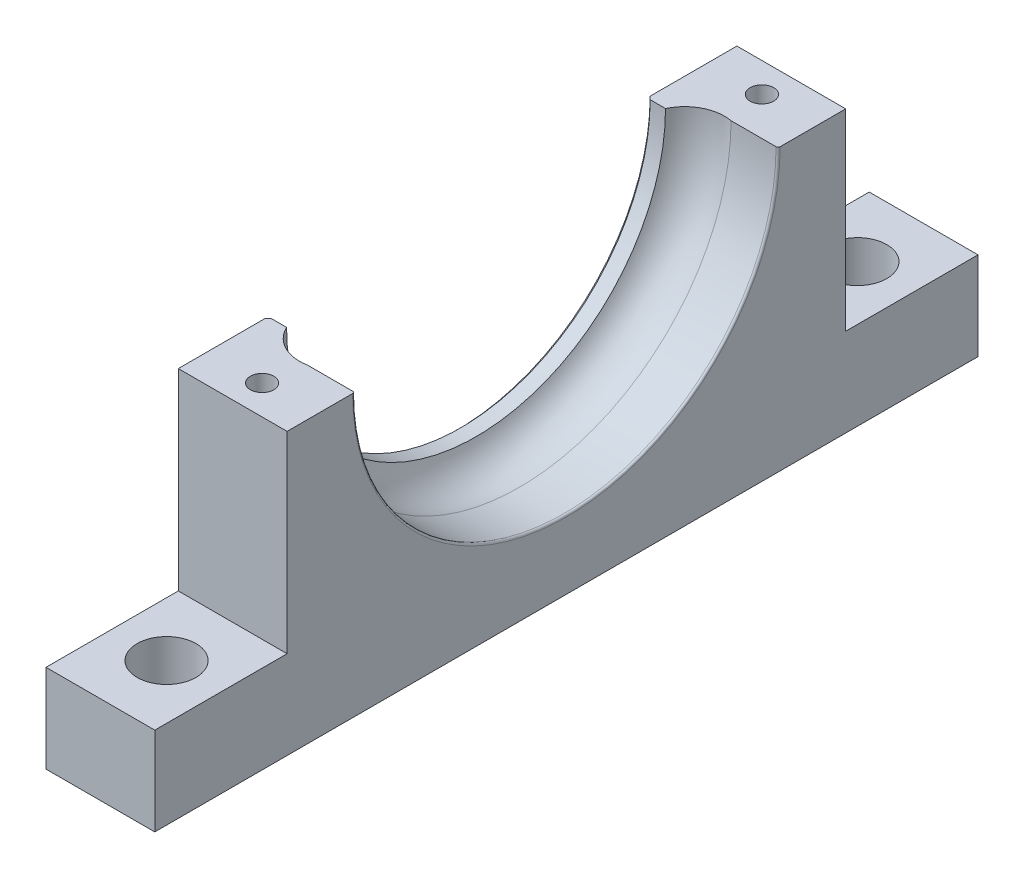
ISO-10303-21;
HEADER;
FILE_DESCRIPTION(('STEP AP214'),'2;1');
FILE_NAME('part.step','',(''),(''),'','','');
FILE_SCHEMA(('AUTOMOTIVE_DESIGN { 1 0 10303 214 1 1 1 1 }'));
ENDSEC;
DATA;
#1=APPLICATION_CONTEXT('core data for automotive mechanical design processes');
#2=APPLICATION_PROTOCOL_DEFINITION('international standard','automotive_design',2000,#1);
#3=PRODUCT_CONTEXT('',#1,'mechanical');
#4=PRODUCT('Part','Part','',(#3));
#5=PRODUCT_RELATED_PRODUCT_CATEGORY('part','',(#4));
#6=PRODUCT_DEFINITION_FORMATION('','',#4);
#7=PRODUCT_DEFINITION_CONTEXT('part definition',#1,'design');
#8=PRODUCT_DEFINITION('design','',#6,#7);
#9=PRODUCT_DEFINITION_SHAPE('','',#8);
#10=(LENGTH_UNIT() NAMED_UNIT(*) SI_UNIT(.MILLI.,.METRE.));
#11=(NAMED_UNIT(*) PLANE_ANGLE_UNIT() SI_UNIT($,.RADIAN.));
#12=(NAMED_UNIT(*) SI_UNIT($,.STERADIAN.) SOLID_ANGLE_UNIT());
#13=UNCERTAINTY_MEASURE_WITH_UNIT(LENGTH_MEASURE(1.E-05),#10,'distance_accuracy_value','');
#14=(GEOMETRIC_REPRESENTATION_CONTEXT(3) GLOBAL_UNCERTAINTY_ASSIGNED_CONTEXT((#13)) GLOBAL_UNIT_ASSIGNED_CONTEXT((#10,
#11,#12)) REPRESENTATION_CONTEXT('',''));
#15=CARTESIAN_POINT('',(0.,0.,0.));
#16=DIRECTION('',(0.,0.,1.));
#17=DIRECTION('',(1.,0.,0.));
#18=AXIS2_PLACEMENT_3D('',#15,#16,#17);
#19=CARTESIAN_POINT('',(-0.159790862732746,0.,95.0000002366093));
#20=DIRECTION('',(0.,-1.,0.));
#21=DIRECTION('',(0.,0.,-1.));
#22=AXIS2_PLACEMENT_3D('',#19,#20,#21);
#23=PLANE('',#22);
#24=DIRECTION('',(0.,0.,1.));
#25=VECTOR('',#24,1.);
#26=CARTESIAN_POINT('',(0.,0.,0.));
#27=LINE('',#26,#25);
#28=CARTESIAN_POINT('',(0.,0.,65.5));
#29=VERTEX_POINT('',#28);
#30=CARTESIAN_POINT('',(0.,0.,95.0000002366093));
#31=VERTEX_POINT('',#30);
#32=EDGE_CURVE('E256',#29,#31,#27,.T.);
#33=ORIENTED_EDGE('',*,*,#32,.T.);
#34=DIRECTION('',(1.,0.,0.));
#35=VECTOR('',#34,1.);
#36=CARTESIAN_POINT('',(37.,0.,95.0000002366093));
#37=LINE('',#36,#35);
#38=CARTESIAN_POINT('',(37.,0.,95.0000002366093));
#39=VERTEX_POINT('',#38);
#40=EDGE_CURVE('E51',#31,#39,#37,.T.);
#41=ORIENTED_EDGE('',*,*,#40,.T.);
#42=DIRECTION('',(0.,0.,-1.));
#43=VECTOR('',#42,1.);
#44=CARTESIAN_POINT('',(36.9999999999182,0.,0.));
#45=LINE('',#44,#43);
#46=CARTESIAN_POINT('',(36.9999999999182,0.,72.7099857785109));
#47=VERTEX_POINT('',#46);
#48=EDGE_CURVE('E66',#39,#47,#45,.T.);
#49=ORIENTED_EDGE('',*,*,#48,.T.);
#50=CARTESIAN_POINT('',(36.2999999999917,0.,72.7100000000707));
#51=DIRECTION('',(0.,-1.,0.));
#52=DIRECTION('',(0.,0.,-1.));
#53=AXIS2_PLACEMENT_3D('',#50,#51,#52);
#54=CIRCLE('',#53,0.700000000070949);
#55=CARTESIAN_POINT('',(36.2999999999917,0.,72.0099999999997));
#56=VERTEX_POINT('',#55);
#57=EDGE_CURVE('E240',#47,#56,#54,.F.);
#58=ORIENTED_EDGE('',*,*,#57,.T.);
#59=DIRECTION('',(1.,0.,0.));
#60=VECTOR('',#59,1.);
#61=CARTESIAN_POINT('',(-0.00128809151422752,0.,72.0099999999997));
#62=LINE('',#61,#60);
#63=CARTESIAN_POINT('',(21.002086329446,0.,72.0099999999998));
#64=VERTEX_POINT('',#63);
#65=EDGE_CURVE('E241',#56,#64,#62,.F.);
#66=ORIENTED_EDGE('',*,*,#65,.T.);
#67=CARTESIAN_POINT('',(18.4999999999997,0.,58.75));
#68=DIRECTION('',(0.,-1.,0.));
#69=DIRECTION('',(0.,0.,-1.));
#70=AXIS2_PLACEMENT_3D('',#67,#68,#69);
#71=CIRCLE('',#70,13.4939999999998);
#72=CARTESIAN_POINT('',(6.26897240621208,0.,64.45));
#73=VERTEX_POINT('',#72);
#74=EDGE_CURVE('E245',#64,#73,#71,.T.);
#75=ORIENTED_EDGE('',*,*,#74,.T.);
#76=DIRECTION('',(1.,0.,0.));
#77=VECTOR('',#76,1.);
#78=CARTESIAN_POINT('',(-0.00128809151422752,0.,64.45));
#79=LINE('',#78,#77);
#80=CARTESIAN_POINT('',(1.05,0.,64.45));
#81=VERTEX_POINT('',#80);
#82=EDGE_CURVE('E249',#73,#81,#79,.F.);
#83=ORIENTED_EDGE('',*,*,#82,.T.);
#84=DIRECTION('',(-0.707106781186544,0.,0.707106781186551));
#85=VECTOR('',#84,1.);
#86=CARTESIAN_POINT('',(65.4999999999994,0.,0.));
#87=LINE('',#86,#85);
#88=EDGE_CURVE('E46',#81,#29,#87,.T.);
#89=ORIENTED_EDGE('',*,*,#88,.T.);
#90=EDGE_LOOP('',(#33,#41,#49,#58,#66,#75,#83,#89));
#91=FACE_BOUND('',#90,.T.);
#92=CARTESIAN_POINT('',(18.5,0.,85.0000002366094));
#93=DIRECTION('',(0.,-1.,0.));
#94=DIRECTION('',(0.,0.,-1.));
#95=AXIS2_PLACEMENT_3D('',#92,#93,#94);
#96=CIRCLE('',#95,4.);
#97=CARTESIAN_POINT('',(18.5,0.,81.0000002366094));
#98=VERTEX_POINT('',#97);
#99=EDGE_CURVE('E11',#98,#98,#96,.T.);
#100=ORIENTED_EDGE('',*,*,#99,.T.);
#101=EDGE_LOOP('',(#100));
#102=FACE_BOUND('',#101,.T.);
#103=ADVANCED_FACE('F43',(#91,#102),#23,.F.);
#104=CARTESIAN_POINT('',(0.,0.,-95.0000002366093));
#105=VERTEX_POINT('',#104);
#106=CARTESIAN_POINT('',(0.,0.,-65.5));
#107=VERTEX_POINT('',#106);
#108=EDGE_CURVE('E231',#105,#107,#27,.T.);
#109=ORIENTED_EDGE('',*,*,#108,.T.);
#110=DIRECTION('',(0.707106781186544,0.,0.707106781186551));
#111=VECTOR('',#110,1.);
#112=CARTESIAN_POINT('',(65.4999999999994,0.,0.));
#113=LINE('',#112,#111);
#114=CARTESIAN_POINT('',(1.05,0.,-64.45));
#115=VERTEX_POINT('',#114);
#116=EDGE_CURVE('E253',#107,#115,#113,.T.);
#117=ORIENTED_EDGE('',*,*,#116,.T.);
#118=DIRECTION('',(1.,0.,0.));
#119=VECTOR('',#118,1.);
#120=CARTESIAN_POINT('',(-0.00128809151422752,0.,-64.45));
#121=LINE('',#120,#119);
#122=CARTESIAN_POINT('',(6.26897240621208,0.,-64.45));
#123=VERTEX_POINT('',#122);
#124=EDGE_CURVE('E250',#115,#123,#121,.T.);
#125=ORIENTED_EDGE('',*,*,#124,.T.);
#126=CARTESIAN_POINT('',(18.4999999999997,0.,-58.75));
#127=DIRECTION('',(0.,-1.,0.));
#128=DIRECTION('',(0.,0.,-1.));
#129=AXIS2_PLACEMENT_3D('',#126,#127,#128);
#130=CIRCLE('',#129,13.4939999999998);
#131=CARTESIAN_POINT('',(21.002086329446,0.,-72.0099999999998));
#132=VERTEX_POINT('',#131);
#133=EDGE_CURVE('E246',#123,#132,#130,.T.);
#134=ORIENTED_EDGE('',*,*,#133,.T.);
#135=DIRECTION('',(1.,0.,0.));
#136=VECTOR('',#135,1.);
#137=CARTESIAN_POINT('',(-0.00128809151422752,0.,-72.0099999999997));
#138=LINE('',#137,#136);
#139=CARTESIAN_POINT('',(36.2999999999917,0.,-72.0099999999997));
#140=VERTEX_POINT('',#139);
#141=EDGE_CURVE('E242',#132,#140,#138,.T.);
#142=ORIENTED_EDGE('',*,*,#141,.T.);
#143=CARTESIAN_POINT('',(36.2999999999917,0.,-72.7100000000707));
#144=DIRECTION('',(0.,-1.,0.));
#145=DIRECTION('',(0.,0.,-1.));
#146=AXIS2_PLACEMENT_3D('',#143,#144,#145);
#147=CIRCLE('',#146,0.700000000070949);
#148=CARTESIAN_POINT('',(36.9999999999182,0.,-72.7099857785109));
#149=VERTEX_POINT('',#148);
#150=EDGE_CURVE('E237',#140,#149,#147,.F.);
#151=ORIENTED_EDGE('',*,*,#150,.T.);
#152=CARTESIAN_POINT('',(37.,0.,-95.0000002366093));
#153=VERTEX_POINT('',#152);
#154=EDGE_CURVE('E233',#149,#153,#45,.T.);
#155=ORIENTED_EDGE('',*,*,#154,.T.);
#156=DIRECTION('',(1.,0.,0.));
#157=VECTOR('',#156,1.);
#158=CARTESIAN_POINT('',(37.,0.,-95.0000002366093));
#159=LINE('',#158,#157);
#160=EDGE_CURVE('E163',#105,#153,#159,.T.);
#161=ORIENTED_EDGE('',*,*,#160,.F.);
#162=EDGE_LOOP('',(#109,#117,#125,#134,#142,#151,#155,#161));
#163=FACE_BOUND('',#162,.T.);
#164=CARTESIAN_POINT('',(18.5,0.,-85.0000002366094));
#165=DIRECTION('',(0.,-1.,0.));
#166=DIRECTION('',(0.,0.,-1.));
#167=AXIS2_PLACEMENT_3D('',#164,#165,#166);
#168=CIRCLE('',#167,4.);
#169=CARTESIAN_POINT('',(18.5,0.,-89.0000002366094));
#170=VERTEX_POINT('',#169);
#171=EDGE_CURVE('E228',#170,#170,#168,.F.);
#172=ORIENTED_EDGE('',*,*,#171,.F.);
#173=EDGE_LOOP('',(#172));
#174=FACE_BOUND('',#173,.T.);
#175=ADVANCED_FACE('F323',(#163,#174),#23,.F.);
#176=CARTESIAN_POINT('',(18.5,-55.4999999999999,-85.0000002366095));
#177=DIRECTION('',(0.,1.,0.));
#178=DIRECTION('',(0.,0.,1.));
#179=AXIS2_PLACEMENT_3D('',#176,#177,#178);
#180=PLANE('',#179);
#181=CARTESIAN_POINT('',(18.5,-55.4999999999999,-85.0000002366095));
#182=DIRECTION('',(0.,1.,0.));
#183=DIRECTION('',(0.,0.,1.));
#184=AXIS2_PLACEMENT_3D('',#181,#182,#183);
#185=CIRCLE('',#184,4.);
#186=CARTESIAN_POINT('',(18.5,-55.4999999999999,-81.0000002366094));
#187=VERTEX_POINT('',#186);
#188=EDGE_CURVE('E187',#187,#187,#185,.T.);
#189=ORIENTED_EDGE('',*,*,#188,.T.);
#190=EDGE_LOOP('',(#189));
#191=FACE_BOUND('',#190,.T.);
#192=ADVANCED_FACE('F327',(#191),#180,.T.);
#193=CARTESIAN_POINT('',(18.5,-55.4999999999999,-85.0000002366095));
#194=DIRECTION('',(0.,1.,0.));
#195=DIRECTION('',(0.,0.,1.));
#196=AXIS2_PLACEMENT_3D('',#193,#194,#195);
#197=CYLINDRICAL_SURFACE('',#196,4.);
#198=ORIENTED_EDGE('',*,*,#171,.T.);
#199=EDGE_LOOP('',(#198));
#200=FACE_BOUND('',#199,.T.);
#201=ORIENTED_EDGE('',*,*,#188,.F.);
#202=EDGE_LOOP('',(#201));
#203=FACE_BOUND('',#202,.T.);
#204=ADVANCED_FACE('F332',(#200,#203),#197,.F.);
#205=CARTESIAN_POINT('',(0.,92.899985,0.));
#206=DIRECTION('',(-1.,0.,0.));
#207=DIRECTION('',(0.,0.,1.));
#208=AXIS2_PLACEMENT_3D('',#205,#206,#207);
#209=PLANE('',#208);
#210=ORIENTED_EDGE('',*,*,#108,.F.);
#211=DIRECTION('',(0.,1.,0.));
#212=VECTOR('',#211,1.);
#213=CARTESIAN_POINT('',(0.,0.,-95.0000002366093));
#214=LINE('',#213,#212);
#215=CARTESIAN_POINT('',(0.,-65.5,-95.0000002366093));
#216=VERTEX_POINT('',#215);
#217=EDGE_CURVE('E186',#216,#105,#214,.T.);
#218=ORIENTED_EDGE('',*,*,#217,.F.);
#219=DIRECTION('',(0.,0.,-1.));
#220=VECTOR('',#219,1.);
#221=CARTESIAN_POINT('',(0.,-65.5,0.));
#222=LINE('',#221,#220);
#223=CARTESIAN_POINT('',(0.,-65.5,-140.000000236609));
#224=VERTEX_POINT('',#223);
#225=EDGE_CURVE('E153',#216,#224,#222,.T.);
#226=ORIENTED_EDGE('',*,*,#225,.T.);
#227=DIRECTION('',(0.,-1.,0.));
#228=VECTOR('',#227,1.);
#229=CARTESIAN_POINT('',(0.,0.,-140.000000236609));
#230=LINE('',#229,#228);
#231=CARTESIAN_POINT('',(0.,-95.5,-140.000000236609));
#232=VERTEX_POINT('',#231);
#233=EDGE_CURVE('E190',#224,#232,#230,.T.);
#234=ORIENTED_EDGE('',*,*,#233,.T.);
#235=DIRECTION('',(0.,0.,1.));
#236=VECTOR('',#235,1.);
#237=CARTESIAN_POINT('',(0.,-95.5,0.));
#238=LINE('',#237,#236);
#239=CARTESIAN_POINT('',(0.,-95.5,140.000000236609));
#240=VERTEX_POINT('',#239);
#241=EDGE_CURVE('E193',#232,#240,#238,.T.);
#242=ORIENTED_EDGE('',*,*,#241,.T.);
#243=DIRECTION('',(0.,1.,0.));
#244=VECTOR('',#243,1.);
#245=CARTESIAN_POINT('',(0.,0.,140.000000236609));
#246=LINE('',#245,#244);
#247=CARTESIAN_POINT('',(0.,-65.5,140.000000236609));
#248=VERTEX_POINT('',#247);
#249=EDGE_CURVE('E196',#240,#248,#246,.T.);
#250=ORIENTED_EDGE('',*,*,#249,.T.);
#251=DIRECTION('',(0.,0.,1.));
#252=VECTOR('',#251,1.);
#253=CARTESIAN_POINT('',(0.,-65.5,0.));
#254=LINE('',#253,#252);
#255=CARTESIAN_POINT('',(0.,-65.5,95.0000002366093));
#256=VERTEX_POINT('',#255);
#257=EDGE_CURVE('E199',#256,#248,#254,.T.);
#258=ORIENTED_EDGE('',*,*,#257,.F.);
#259=DIRECTION('',(0.,1.,0.));
#260=VECTOR('',#259,1.);
#261=CARTESIAN_POINT('',(0.,0.,95.0000002366093));
#262=LINE('',#261,#260);
#263=EDGE_CURVE('E183',#256,#31,#262,.T.);
#264=ORIENTED_EDGE('',*,*,#263,.T.);
#265=ORIENTED_EDGE('',*,*,#32,.F.);
#266=CARTESIAN_POINT('',(0.,0.,0.));
#267=DIRECTION('',(1.,0.,0.));
#268=DIRECTION('',(0.,0.,-1.));
#269=AXIS2_PLACEMENT_3D('',#266,#267,#268);
#270=CIRCLE('',#269,65.5);
#271=EDGE_CURVE('E226',#29,#107,#270,.T.);
#272=ORIENTED_EDGE('',*,*,#271,.T.);
#273=EDGE_LOOP('',(#210,#218,#226,#234,#242,#250,#258,#264,#265,#272));
#274=FACE_BOUND('',#273,.T.);
#275=ADVANCED_FACE('F277',(#274),#209,.T.);
#276=CARTESIAN_POINT('',(0.,0.,0.));
#277=DIRECTION('',(-1.,0.,0.));
#278=DIRECTION('',(0.,0.,1.));
#279=AXIS2_PLACEMENT_3D('',#276,#277,#278);
#280=CONICAL_SURFACE('',#279,65.5,0.785398163397453);
#281=ORIENTED_EDGE('',*,*,#88,.F.);
#282=CARTESIAN_POINT('',(1.05,0.,0.));
#283=DIRECTION('',(1.,0.,0.));
#284=DIRECTION('',(0.,0.,-1.));
#285=AXIS2_PLACEMENT_3D('',#282,#283,#284);
#286=CIRCLE('',#285,64.45);
#287=EDGE_CURVE('E223',#81,#115,#286,.T.);
#288=ORIENTED_EDGE('',*,*,#287,.T.);
#289=ORIENTED_EDGE('',*,*,#116,.F.);
#290=ORIENTED_EDGE('',*,*,#271,.F.);
#291=EDGE_LOOP('',(#281,#288,#289,#290));
#292=FACE_BOUND('',#291,.T.);
#293=ADVANCED_FACE('F272',(#292),#280,.F.);
#294=CARTESIAN_POINT('',(-0.00128809151422752,0.,0.));
#295=DIRECTION('',(1.,0.,0.));
#296=DIRECTION('',(0.,0.,-1.));
#297=AXIS2_PLACEMENT_3D('',#294,#295,#296);
#298=CYLINDRICAL_SURFACE('',#297,64.45);
#299=ORIENTED_EDGE('',*,*,#124,.F.);
#300=ORIENTED_EDGE('',*,*,#287,.F.);
#301=ORIENTED_EDGE('',*,*,#82,.F.);
#302=CARTESIAN_POINT('',(6.26897240621208,0.,0.));
#303=DIRECTION('',(1.,0.,0.));
#304=DIRECTION('',(0.,0.,-1.));
#305=AXIS2_PLACEMENT_3D('',#302,#303,#304);
#306=CIRCLE('',#305,64.45);
#307=EDGE_CURVE('E220',#73,#123,#306,.T.);
#308=ORIENTED_EDGE('',*,*,#307,.T.);
#309=EDGE_LOOP('',(#299,#300,#301,#308));
#310=FACE_BOUND('',#309,.T.);
#311=ADVANCED_FACE('F270',(#310),#298,.F.);
#312=CARTESIAN_POINT('',(18.4999999999997,0.,0.));
#313=DIRECTION('',(1.,0.,0.));
#314=DIRECTION('',(0.,0.,-1.));
#315=AXIS2_PLACEMENT_3D('',#312,#313,#314);
#316=TOROIDAL_SURFACE('',#315,58.75,13.4939999999998);
#317=ORIENTED_EDGE('',*,*,#133,.F.);
#318=ORIENTED_EDGE('',*,*,#307,.F.);
#319=ORIENTED_EDGE('',*,*,#74,.F.);
#320=CARTESIAN_POINT('',(21.002086329446,0.,0.));
#321=DIRECTION('',(1.,0.,0.));
#322=DIRECTION('',(0.,0.,-1.));
#323=AXIS2_PLACEMENT_3D('',#320,#321,#322);
#324=CIRCLE('',#323,72.0099999999998);
#325=EDGE_CURVE('E217',#64,#132,#324,.T.);
#326=ORIENTED_EDGE('',*,*,#325,.T.);
#327=EDGE_LOOP('',(#317,#318,#319,#326));
#328=FACE_BOUND('',#327,.T.);
#329=ADVANCED_FACE('F457',(#328),#316,.F.);
#330=CARTESIAN_POINT('',(-0.00128809151422752,0.,0.));
#331=DIRECTION('',(1.,0.,0.));
#332=DIRECTION('',(0.,0.,-1.));
#333=AXIS2_PLACEMENT_3D('',#330,#331,#332);
#334=CYLINDRICAL_SURFACE('',#333,72.0099999999997);
#335=ORIENTED_EDGE('',*,*,#141,.F.);
#336=ORIENTED_EDGE('',*,*,#325,.F.);
#337=ORIENTED_EDGE('',*,*,#65,.F.);
#338=CARTESIAN_POINT('',(36.2999999999917,0.,0.));
#339=DIRECTION('',(1.,0.,0.));
#340=DIRECTION('',(0.,0.,-1.));
#341=AXIS2_PLACEMENT_3D('',#338,#339,#340);
#342=CIRCLE('',#341,72.0099999999997);
#343=EDGE_CURVE('E214',#56,#140,#342,.T.);
#344=ORIENTED_EDGE('',*,*,#343,.T.);
#345=EDGE_LOOP('',(#335,#336,#337,#344));
#346=FACE_BOUND('',#345,.T.);
#347=ADVANCED_FACE('F465',(#346),#334,.F.);
#348=CARTESIAN_POINT('',(36.2999999999917,0.,0.));
#349=DIRECTION('',(1.,0.,0.));
#350=DIRECTION('',(0.,0.,-1.));
#351=AXIS2_PLACEMENT_3D('',#348,#349,#350);
#352=TOROIDAL_SURFACE('',#351,72.7100000000707,0.700000000070949);
#353=ORIENTED_EDGE('',*,*,#150,.F.);
#354=ORIENTED_EDGE('',*,*,#343,.F.);
#355=ORIENTED_EDGE('',*,*,#57,.F.);
#356=CARTESIAN_POINT('',(36.9999999999182,0.,0.));
#357=DIRECTION('',(1.,0.,0.));
#358=DIRECTION('',(0.,0.,-1.));
#359=AXIS2_PLACEMENT_3D('',#356,#357,#358);
#360=CIRCLE('',#359,72.7099857785109);
#361=EDGE_CURVE('E204',#47,#149,#360,.T.);
#362=ORIENTED_EDGE('',*,*,#361,.T.);
#363=EDGE_LOOP('',(#353,#354,#355,#362));
#364=FACE_BOUND('',#363,.T.);
#365=ADVANCED_FACE('F474',(#364),#352,.T.);
#366=CARTESIAN_POINT('',(36.9999999999182,72.7099857785109,0.));
#367=DIRECTION('',(1.,0.,0.));
#368=DIRECTION('',(0.,0.,-1.));
#369=AXIS2_PLACEMENT_3D('',#366,#367,#368);
#370=PLANE('',#369);
#371=ORIENTED_EDGE('',*,*,#48,.F.);
#372=DIRECTION('',(0.,1.,0.));
#373=VECTOR('',#372,1.);
#374=CARTESIAN_POINT('',(37.,0.,95.0000002366093));
#375=LINE('',#374,#373);
#376=CARTESIAN_POINT('',(37.,-65.5,95.0000002366093));
#377=VERTEX_POINT('',#376);
#378=EDGE_CURVE('E165',#377,#39,#375,.T.);
#379=ORIENTED_EDGE('',*,*,#378,.F.);
#380=DIRECTION('',(0.,0.,1.));
#381=VECTOR('',#380,1.);
#382=CARTESIAN_POINT('',(37.,-65.5,0.));
#383=LINE('',#382,#381);
#384=CARTESIAN_POINT('',(37.,-65.5,140.000000236609));
#385=VERTEX_POINT('',#384);
#386=EDGE_CURVE('E158',#377,#385,#383,.T.);
#387=ORIENTED_EDGE('',*,*,#386,.T.);
#388=DIRECTION('',(0.,1.,0.));
#389=VECTOR('',#388,1.);
#390=CARTESIAN_POINT('',(37.,0.,140.000000236609));
#391=LINE('',#390,#389);
#392=CARTESIAN_POINT('',(37.,-95.5,140.000000236609));
#393=VERTEX_POINT('',#392);
#394=EDGE_CURVE('E179',#393,#385,#391,.T.);
#395=ORIENTED_EDGE('',*,*,#394,.F.);
#396=DIRECTION('',(0.,0.,1.));
#397=VECTOR('',#396,1.);
#398=CARTESIAN_POINT('',(37.,-95.5,0.));
#399=LINE('',#398,#397);
#400=CARTESIAN_POINT('',(37.,-95.5,-140.000000236609));
#401=VERTEX_POINT('',#400);
#402=EDGE_CURVE('E173',#401,#393,#399,.T.);
#403=ORIENTED_EDGE('',*,*,#402,.F.);
#404=DIRECTION('',(0.,-1.,0.));
#405=VECTOR('',#404,1.);
#406=CARTESIAN_POINT('',(37.,0.,-140.000000236609));
#407=LINE('',#406,#405);
#408=CARTESIAN_POINT('',(37.,-65.5,-140.000000236609));
#409=VERTEX_POINT('',#408);
#410=EDGE_CURVE('E171',#409,#401,#407,.T.);
#411=ORIENTED_EDGE('',*,*,#410,.F.);
#412=DIRECTION('',(0.,0.,-1.));
#413=VECTOR('',#412,1.);
#414=CARTESIAN_POINT('',(37.,-65.5,0.));
#415=LINE('',#414,#413);
#416=CARTESIAN_POINT('',(37.,-65.5,-95.0000002366093));
#417=VERTEX_POINT('',#416);
#418=EDGE_CURVE('E151',#417,#409,#415,.T.);
#419=ORIENTED_EDGE('',*,*,#418,.F.);
#420=DIRECTION('',(0.,1.,0.));
#421=VECTOR('',#420,1.);
#422=CARTESIAN_POINT('',(37.,0.,-95.0000002366093));
#423=LINE('',#422,#421);
#424=EDGE_CURVE('E161',#417,#153,#423,.T.);
#425=ORIENTED_EDGE('',*,*,#424,.T.);
#426=ORIENTED_EDGE('',*,*,#154,.F.);
#427=ORIENTED_EDGE('',*,*,#361,.F.);
#428=EDGE_LOOP('',(#371,#379,#387,#395,#403,#411,#419,#425,#426,#427));
#429=FACE_BOUND('',#428,.T.);
#430=ADVANCED_FACE('F168',(#429),#370,.T.);
#431=CARTESIAN_POINT('',(37.,0.,95.0000002366093));
#432=DIRECTION('',(0.,0.,1.));
#433=DIRECTION('',(1.,0.,0.));
#434=AXIS2_PLACEMENT_3D('',#431,#432,#433);
#435=PLANE('',#434);
#436=ORIENTED_EDGE('',*,*,#40,.F.);
#437=ORIENTED_EDGE('',*,*,#263,.F.);
#438=DIRECTION('',(-1.,0.,0.));
#439=VECTOR('',#438,1.);
#440=CARTESIAN_POINT('',(37.,-65.5,95.0000002366093));
#441=LINE('',#440,#439);
#442=EDGE_CURVE('E202',#377,#256,#441,.T.);
#443=ORIENTED_EDGE('',*,*,#442,.F.);
#444=ORIENTED_EDGE('',*,*,#378,.T.);
#445=EDGE_LOOP('',(#436,#437,#443,#444));
#446=FACE_BOUND('',#445,.T.);
#447=ADVANCED_FACE('F279',(#446),#435,.T.);
#448=CARTESIAN_POINT('',(37.,-65.5,0.));
#449=DIRECTION('',(0.,-1.,0.));
#450=DIRECTION('',(0.,0.,-1.));
#451=AXIS2_PLACEMENT_3D('',#448,#449,#450);
#452=PLANE('',#451);
#453=CARTESIAN_POINT('',(18.5,-65.5,117.500000236609));
#454=DIRECTION('',(0.,-1.,0.));
#455=DIRECTION('',(0.,0.,-1.));
#456=AXIS2_PLACEMENT_3D('',#453,#454,#455);
#457=CIRCLE('',#456,10.);
#458=CARTESIAN_POINT('',(18.5,-65.5,107.500000236609));
#459=VERTEX_POINT('',#458);
#460=EDGE_CURVE('E294',#459,#459,#457,.T.);
#461=ORIENTED_EDGE('',*,*,#460,.T.);
#462=EDGE_LOOP('',(#461));
#463=FACE_BOUND('',#462,.T.);
#464=ORIENTED_EDGE('',*,*,#257,.T.);
#465=DIRECTION('',(-1.,0.,0.));
#466=VECTOR('',#465,1.);
#467=CARTESIAN_POINT('',(37.,-65.5,140.000000236609));
#468=LINE('',#467,#466);
#469=EDGE_CURVE('E205',#385,#248,#468,.T.);
#470=ORIENTED_EDGE('',*,*,#469,.F.);
#471=ORIENTED_EDGE('',*,*,#386,.F.);
#472=ORIENTED_EDGE('',*,*,#442,.T.);
#473=EDGE_LOOP('',(#464,#470,#471,#472));
#474=FACE_BOUND('',#473,.T.);
#475=ADVANCED_FACE('F356',(#463,#474),#452,.F.);
#476=CARTESIAN_POINT('',(37.,0.,140.000000236609));
#477=DIRECTION('',(0.,0.,1.));
#478=DIRECTION('',(1.,0.,0.));
#479=AXIS2_PLACEMENT_3D('',#476,#477,#478);
#480=PLANE('',#479);
#481=ORIENTED_EDGE('',*,*,#249,.F.);
#482=DIRECTION('',(-1.,0.,0.));
#483=VECTOR('',#482,1.);
#484=CARTESIAN_POINT('',(37.,-95.5,140.000000236609));
#485=LINE('',#484,#483);
#486=EDGE_CURVE('E207',#393,#240,#485,.T.);
#487=ORIENTED_EDGE('',*,*,#486,.F.);
#488=ORIENTED_EDGE('',*,*,#394,.T.);
#489=ORIENTED_EDGE('',*,*,#469,.T.);
#490=EDGE_LOOP('',(#481,#487,#488,#489));
#491=FACE_BOUND('',#490,.T.);
#492=ADVANCED_FACE('F307',(#491),#480,.T.);
#493=CARTESIAN_POINT('',(37.,-95.5,0.));
#494=DIRECTION('',(0.,-1.,0.));
#495=DIRECTION('',(0.,0.,-1.));
#496=AXIS2_PLACEMENT_3D('',#493,#494,#495);
#497=PLANE('',#496);
#498=CARTESIAN_POINT('',(18.5,-95.5,117.500000236609));
#499=DIRECTION('',(0.,-1.,0.));
#500=DIRECTION('',(0.,0.,-1.));
#501=AXIS2_PLACEMENT_3D('',#498,#499,#500);
#502=CIRCLE('',#501,10.);
#503=CARTESIAN_POINT('',(18.5,-95.5,107.500000236609));
#504=VERTEX_POINT('',#503);
#505=EDGE_CURVE('E293',#504,#504,#502,.T.);
#506=ORIENTED_EDGE('',*,*,#505,.F.);
#507=EDGE_LOOP('',(#506));
#508=FACE_BOUND('',#507,.T.);
#509=CARTESIAN_POINT('',(18.5,-95.5,-117.500000236609));
#510=DIRECTION('',(0.,1.,0.));
#511=DIRECTION('',(0.,0.,1.));
#512=AXIS2_PLACEMENT_3D('',#509,#510,#511);
#513=CIRCLE('',#512,10.);
#514=CARTESIAN_POINT('',(18.5,-95.5,-107.500000236609));
#515=VERTEX_POINT('',#514);
#516=EDGE_CURVE('E284',#515,#515,#513,.T.);
#517=ORIENTED_EDGE('',*,*,#516,.T.);
#518=EDGE_LOOP('',(#517));
#519=FACE_BOUND('',#518,.T.);
#520=ORIENTED_EDGE('',*,*,#241,.F.);
#521=DIRECTION('',(-1.,0.,0.));
#522=VECTOR('',#521,1.);
#523=CARTESIAN_POINT('',(37.,-95.5,-140.000000236609));
#524=LINE('',#523,#522);
#525=EDGE_CURVE('E209',#401,#232,#524,.T.);
#526=ORIENTED_EDGE('',*,*,#525,.F.);
#527=ORIENTED_EDGE('',*,*,#402,.T.);
#528=ORIENTED_EDGE('',*,*,#486,.T.);
#529=EDGE_LOOP('',(#520,#526,#527,#528));
#530=FACE_BOUND('',#529,.T.);
#531=ADVANCED_FACE('F303',(#508,#519,#530),#497,.T.);
#532=CARTESIAN_POINT('',(37.,0.,-140.000000236609));
#533=DIRECTION('',(0.,0.,-1.));
#534=DIRECTION('',(-1.,0.,0.));
#535=AXIS2_PLACEMENT_3D('',#532,#533,#534);
#536=PLANE('',#535);
#537=ORIENTED_EDGE('',*,*,#233,.F.);
#538=DIRECTION('',(-1.,0.,0.));
#539=VECTOR('',#538,1.);
#540=CARTESIAN_POINT('',(37.,-65.5,-140.000000236609));
#541=LINE('',#540,#539);
#542=EDGE_CURVE('E157',#409,#224,#541,.T.);
#543=ORIENTED_EDGE('',*,*,#542,.F.);
#544=ORIENTED_EDGE('',*,*,#410,.T.);
#545=ORIENTED_EDGE('',*,*,#525,.T.);
#546=EDGE_LOOP('',(#537,#543,#544,#545));
#547=FACE_BOUND('',#546,.T.);
#548=ADVANCED_FACE('F306',(#547),#536,.T.);
#549=CARTESIAN_POINT('',(37.,-65.5,0.));
#550=DIRECTION('',(0.,1.,0.));
#551=DIRECTION('',(0.,0.,1.));
#552=AXIS2_PLACEMENT_3D('',#549,#550,#551);
#553=PLANE('',#552);
#554=CARTESIAN_POINT('',(18.5,-65.5,-117.500000236609));
#555=DIRECTION('',(0.,1.,0.));
#556=DIRECTION('',(0.,0.,1.));
#557=AXIS2_PLACEMENT_3D('',#554,#555,#556);
#558=CIRCLE('',#557,10.);
#559=CARTESIAN_POINT('',(18.5,-65.5,-107.500000236609));
#560=VERTEX_POINT('',#559);
#561=EDGE_CURVE('E285',#560,#560,#558,.T.);
#562=ORIENTED_EDGE('',*,*,#561,.F.);
#563=EDGE_LOOP('',(#562));
#564=FACE_BOUND('',#563,.T.);
#565=ORIENTED_EDGE('',*,*,#225,.F.);
#566=DIRECTION('',(-1.,0.,0.));
#567=VECTOR('',#566,1.);
#568=CARTESIAN_POINT('',(37.,-65.5,-95.0000002366093));
#569=LINE('',#568,#567);
#570=EDGE_CURVE('E147',#417,#216,#569,.T.);
#571=ORIENTED_EDGE('',*,*,#570,.F.);
#572=ORIENTED_EDGE('',*,*,#418,.T.);
#573=ORIENTED_EDGE('',*,*,#542,.T.);
#574=EDGE_LOOP('',(#565,#571,#572,#573));
#575=FACE_BOUND('',#574,.T.);
#576=ADVANCED_FACE('F149',(#564,#575),#553,.T.);
#577=CARTESIAN_POINT('',(37.,0.,-95.0000002366093));
#578=DIRECTION('',(0.,0.,1.));
#579=DIRECTION('',(1.,0.,0.));
#580=AXIS2_PLACEMENT_3D('',#577,#578,#579);
#581=PLANE('',#580);
#582=ORIENTED_EDGE('',*,*,#217,.T.);
#583=ORIENTED_EDGE('',*,*,#160,.T.);
#584=ORIENTED_EDGE('',*,*,#424,.F.);
#585=ORIENTED_EDGE('',*,*,#570,.T.);
#586=EDGE_LOOP('',(#582,#583,#584,#585));
#587=FACE_BOUND('',#586,.T.);
#588=ADVANCED_FACE('F162',(#587),#581,.F.);
#589=CARTESIAN_POINT('',(18.5,-95.5,-117.500000236609));
#590=DIRECTION('',(0.,1.,0.));
#591=DIRECTION('',(0.,0.,1.));
#592=AXIS2_PLACEMENT_3D('',#589,#590,#591);
#593=CYLINDRICAL_SURFACE('',#592,10.);
#594=ORIENTED_EDGE('',*,*,#516,.F.);
#595=EDGE_LOOP('',(#594));
#596=FACE_BOUND('',#595,.T.);
#597=ORIENTED_EDGE('',*,*,#561,.T.);
#598=EDGE_LOOP('',(#597));
#599=FACE_BOUND('',#598,.T.);
#600=ADVANCED_FACE('F339',(#596,#599),#593,.F.);
#601=CARTESIAN_POINT('',(18.5,-95.5,117.500000236609));
#602=DIRECTION('',(0.,1.,0.));
#603=DIRECTION('',(0.,0.,1.));
#604=AXIS2_PLACEMENT_3D('',#601,#602,#603);
#605=CYLINDRICAL_SURFACE('',#604,10.);
#606=ORIENTED_EDGE('',*,*,#505,.T.);
#607=EDGE_LOOP('',(#606));
#608=FACE_BOUND('',#607,.T.);
#609=ORIENTED_EDGE('',*,*,#460,.F.);
#610=EDGE_LOOP('',(#609));
#611=FACE_BOUND('',#610,.T.);
#612=ADVANCED_FACE('F300',(#608,#611),#605,.F.);
#613=CARTESIAN_POINT('',(18.5,-55.4999999999999,85.0000002366095));
#614=DIRECTION('',(0.,1.,0.));
#615=DIRECTION('',(0.,0.,-1.));
#616=AXIS2_PLACEMENT_3D('',#613,#614,#615);
#617=PLANE('',#616);
#618=CARTESIAN_POINT('',(18.5,-55.4999999999999,85.0000002366095));
#619=DIRECTION('',(0.,-1.,0.));
#620=DIRECTION('',(0.,0.,-1.));
#621=AXIS2_PLACEMENT_3D('',#618,#619,#620);
#622=CIRCLE('',#621,4.);
#623=CARTESIAN_POINT('',(18.5,-55.4999999999999,81.0000002366094));
#624=VERTEX_POINT('',#623);
#625=EDGE_CURVE('E288',#624,#624,#622,.T.);
#626=ORIENTED_EDGE('',*,*,#625,.F.);
#627=EDGE_LOOP('',(#626));
#628=FACE_BOUND('',#627,.T.);
#629=ADVANCED_FACE('F338',(#628),#617,.T.);
#630=CARTESIAN_POINT('',(18.5,-55.4999999999999,85.0000002366095));
#631=DIRECTION('',(0.,1.,0.));
#632=DIRECTION('',(0.,0.,1.));
#633=AXIS2_PLACEMENT_3D('',#630,#631,#632);
#634=CYLINDRICAL_SURFACE('',#633,4.);
#635=ORIENTED_EDGE('',*,*,#99,.F.);
#636=EDGE_LOOP('',(#635));
#637=FACE_BOUND('',#636,.T.);
#638=ORIENTED_EDGE('',*,*,#625,.T.);
#639=EDGE_LOOP('',(#638));
#640=FACE_BOUND('',#639,.T.);
#641=ADVANCED_FACE('F335',(#637,#640),#634,.F.);
#642=CLOSED_SHELL('',(#103,#175,#192,#204,#275,#293,#311,#329,#347,#365,#430,#447,#475,#492,
#531,#548,#576,#588,#600,#612,#629,#641));
#643=MANIFOLD_SOLID_BREP('B2',#642);
#644=ADVANCED_BREP_SHAPE_REPRESENTATION('',(#18,#643),#14);
#645=SHAPE_DEFINITION_REPRESENTATION(#9,#644);
ENDSEC;
END-ISO-10303-21;
